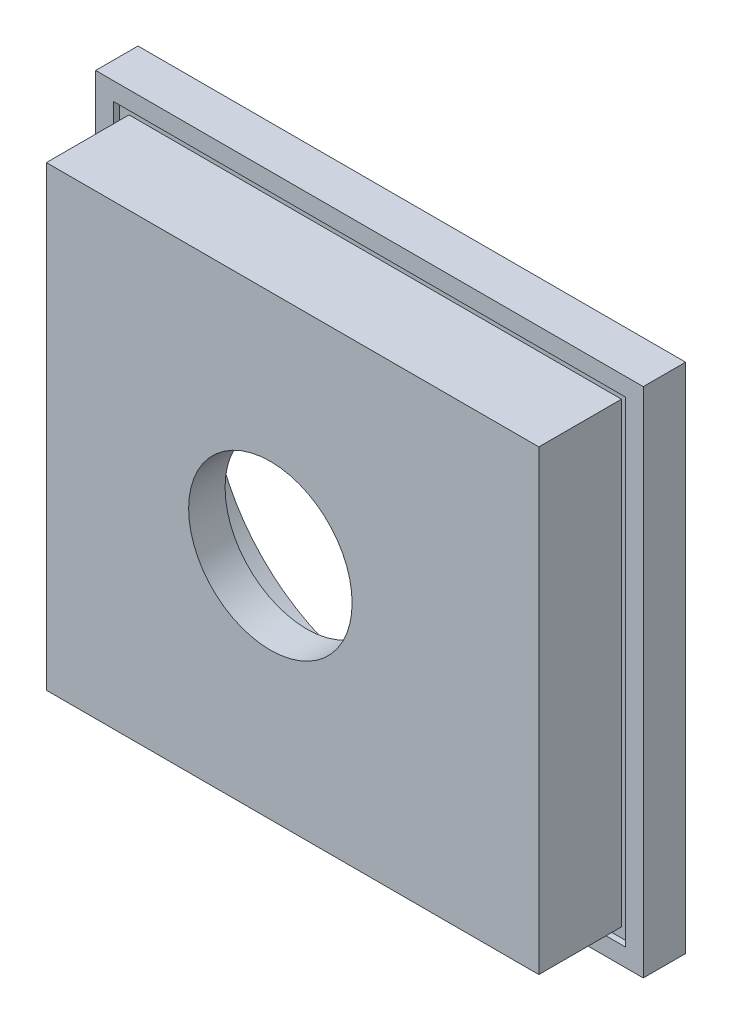
ISO-10303-21;
HEADER;
FILE_DESCRIPTION(('STEP AP214'),'2;1');
FILE_NAME('part.step','',(''),(''),'','','');
FILE_SCHEMA(('AUTOMOTIVE_DESIGN { 1 0 10303 214 1 1 1 1 }'));
ENDSEC;
DATA;
#1=APPLICATION_CONTEXT('core data for automotive mechanical design processes');
#2=APPLICATION_PROTOCOL_DEFINITION('international standard','automotive_design',2000,#1);
#3=PRODUCT_CONTEXT('',#1,'mechanical');
#4=PRODUCT('Part','Part','',(#3));
#5=PRODUCT_RELATED_PRODUCT_CATEGORY('part','',(#4));
#6=PRODUCT_DEFINITION_FORMATION('','',#4);
#7=PRODUCT_DEFINITION_CONTEXT('part definition',#1,'design');
#8=PRODUCT_DEFINITION('design','',#6,#7);
#9=PRODUCT_DEFINITION_SHAPE('','',#8);
#10=(LENGTH_UNIT() NAMED_UNIT(*) SI_UNIT(.MILLI.,.METRE.));
#11=(NAMED_UNIT(*) PLANE_ANGLE_UNIT() SI_UNIT($,.RADIAN.));
#12=(NAMED_UNIT(*) SI_UNIT($,.STERADIAN.) SOLID_ANGLE_UNIT());
#13=UNCERTAINTY_MEASURE_WITH_UNIT(LENGTH_MEASURE(1.E-05),#10,'distance_accuracy_value','');
#14=(GEOMETRIC_REPRESENTATION_CONTEXT(3) GLOBAL_UNCERTAINTY_ASSIGNED_CONTEXT((#13)) GLOBAL_UNIT_ASSIGNED_CONTEXT((#10,
#11,#12)) REPRESENTATION_CONTEXT('',''));
#15=CARTESIAN_POINT('',(0.,0.,0.));
#16=DIRECTION('',(0.,0.,1.));
#17=DIRECTION('',(1.,0.,0.));
#18=AXIS2_PLACEMENT_3D('',#15,#16,#17);
#19=CARTESIAN_POINT('',(127.7,130.,42.));
#20=DIRECTION('',(0.,0.,-1.));
#21=DIRECTION('',(-1.,0.,0.));
#22=AXIS2_PLACEMENT_3D('',#19,#20,#21);
#23=CYLINDRICAL_SURFACE('',#22,90.5);
#24=CARTESIAN_POINT('',(127.7,130.,0.));
#25=DIRECTION('',(0.,0.,1.));
#26=DIRECTION('',(1.,0.,0.));
#27=AXIS2_PLACEMENT_3D('',#24,#25,#26);
#28=CIRCLE('',#27,90.5);
#29=CARTESIAN_POINT('',(218.2,130.,0.));
#30=VERTEX_POINT('',#29);
#31=EDGE_CURVE('E272',#30,#30,#28,.T.);
#32=ORIENTED_EDGE('',*,*,#31,.F.);
#33=EDGE_LOOP('',(#32));
#34=FACE_BOUND('',#33,.T.);
#35=CARTESIAN_POINT('',(127.7,130.,42.));
#36=DIRECTION('',(0.,0.,1.));
#37=DIRECTION('',(1.,0.,0.));
#38=AXIS2_PLACEMENT_3D('',#35,#36,#37);
#39=CIRCLE('',#38,90.5);
#40=CARTESIAN_POINT('',(218.2,130.,42.));
#41=VERTEX_POINT('',#40);
#42=EDGE_CURVE('E268',#41,#41,#39,.T.);
#43=ORIENTED_EDGE('',*,*,#42,.T.);
#44=EDGE_LOOP('',(#43));
#45=FACE_BOUND('',#44,.T.);
#46=CARTESIAN_POINT('',(127.7,39.5,6.00000000000001));
#47=CARTESIAN_POINT('',(127.868461668725,39.5000006693389,6.00000745533471));
#48=CARTESIAN_POINT('',(128.03704430966,39.500475420697,6.01423729962665));
#49=CARTESIAN_POINT('',(128.369563332918,39.5023236582684,6.07080359932299));
#50=CARTESIAN_POINT('',(128.533493931284,39.503698216181,6.11317357142256));
#51=CARTESIAN_POINT('',(128.85184360416,39.5071904127946,6.22480957151065));
#52=CARTESIAN_POINT('',(129.006267312642,39.5093076860463,6.29406237371838));
#53=CARTESIAN_POINT('',(129.301254428058,39.5140465352439,6.45747905954885));
#54=CARTESIAN_POINT('',(129.44182119319,39.5166679885465,6.55163688702526));
#55=CARTESIAN_POINT('',(129.705221105626,39.5221215987173,6.76224808929431));
#56=CARTESIAN_POINT('',(129.828046288442,39.5249538493569,6.87871142316518));
#57=CARTESIAN_POINT('',(130.05240927785,39.5305090185251,7.13060969742526));
#58=CARTESIAN_POINT('',(130.153946233978,39.5332319326823,7.26604539539932));
#59=CARTESIAN_POINT('',(130.332865243994,39.5382618860058,7.55207638745825));
#60=CARTESIAN_POINT('',(130.410242173459,39.5405688369013,7.70267488867855));
#61=CARTESIAN_POINT('',(130.538611467042,39.544505788466,8.01473376018372));
#62=CARTESIAN_POINT('',(130.589603948693,39.5461357921509,8.17619408207942));
#63=CARTESIAN_POINT('',(130.663738797212,39.548534328688,8.50533001640761));
#64=CARTESIAN_POINT('',(130.686891473895,39.5493031804403,8.67300330428781));
#65=CARTESIAN_POINT('',(130.704721263274,39.5498936791272,9.00985822785477));
#66=CARTESIAN_POINT('',(130.699398503432,39.5497153303018,9.17903985678646));
#67=CARTESIAN_POINT('',(130.66043719998,39.5484318367469,9.51403906557217));
#68=CARTESIAN_POINT('',(130.626809797713,39.5473270566822,9.67985794278446));
#69=CARTESIAN_POINT('',(130.53221100757,39.5443158135154,10.0034956636558));
#70=CARTESIAN_POINT('',(130.471239552596,39.542409348446,10.1613144876831));
#71=CARTESIAN_POINT('',(130.32367063419,39.5380092236007,10.4645080649017));
#72=CARTESIAN_POINT('',(130.237068067339,39.5355154469051,10.6098803324154));
#73=CARTESIAN_POINT('',(130.040699033776,39.5302219378146,10.8840269513121));
#74=CARTESIAN_POINT('',(129.930932500387,39.5274222045389,11.0128012549155));
#75=CARTESIAN_POINT('',(129.691288400419,39.5218307656828,11.2501614086873));
#76=CARTESIAN_POINT('',(129.561401175114,39.519039064617,11.3587375075367));
#77=CARTESIAN_POINT('',(129.285236774167,39.5137796928698,11.5525440814761));
#78=CARTESIAN_POINT('',(129.138959595728,39.5113120222435,11.6377745525837));
#79=CARTESIAN_POINT('',(128.834162118433,39.5069788338669,11.7824694127845));
#80=CARTESIAN_POINT('',(128.675641671906,39.5051133233809,11.841933491041));
#81=CARTESIAN_POINT('',(128.350859939355,39.5021948558943,11.9334013484784));
#82=CARTESIAN_POINT('',(128.184598678986,39.501141896201,11.9654052186599));
#83=CARTESIAN_POINT('',(127.849139605765,39.4999675663169,12.001032226987));
#84=CARTESIAN_POINT('',(127.6799432273,39.4998457532538,12.0046688571849));
#85=CARTESIAN_POINT('',(127.343342384133,39.5005462740504,11.9834933207665));
#86=CARTESIAN_POINT('',(127.175937916878,39.5013686065642,11.9586811946998));
#87=CARTESIAN_POINT('',(126.847710550792,39.5038644623065,11.8813236392684));
#88=CARTESIAN_POINT('',(126.686886205605,39.5055377973808,11.8287843402005));
#89=CARTESIAN_POINT('',(126.376339885381,39.5095471193318,11.6974700602185));
#90=CARTESIAN_POINT('',(126.226617937851,39.5118831078503,11.618695014303));
#91=CARTESIAN_POINT('',(125.942464397464,39.5169557336091,11.4371106631431));
#92=CARTESIAN_POINT('',(125.808038607134,39.5196925219966,11.3342922820566));
#93=CARTESIAN_POINT('',(125.558351526558,39.5252578345468,11.1075532180054));
#94=CARTESIAN_POINT('',(125.443090294434,39.5280863589877,10.9836324710442));
#95=CARTESIAN_POINT('',(125.234959079449,39.5335175435777,10.7181484906926));
#96=CARTESIAN_POINT('',(125.142097805167,39.5361201156309,10.5765784280009));
#97=CARTESIAN_POINT('',(124.981462031146,39.540804575463,10.2798492708986));
#98=CARTESIAN_POINT('',(124.913687468302,39.5428864645515,10.124690210672));
#99=CARTESIAN_POINT('',(124.805164241662,39.5462941959245,9.80522017789086));
#100=CARTESIAN_POINT('',(124.7644099534,39.5476201955446,9.64091111769872));
#101=CARTESIAN_POINT('',(124.71106570951,39.5493670837606,9.30777817771377));
#102=CARTESIAN_POINT('',(124.698475712356,39.5497879736909,9.13895430457782));
#103=CARTESIAN_POINT('',(124.701818072997,39.5496771311941,8.80167108482766));
#104=CARTESIAN_POINT('',(124.717736704094,39.549145857227,8.63321160186203));
#105=CARTESIAN_POINT('',(124.777616193726,39.5471915412763,8.3013576877107));
#106=CARTESIAN_POINT('',(124.821577107632,39.5457684975319,8.13796326652712));
#107=CARTESIAN_POINT('',(124.936291156051,39.5421911362467,7.82087297961637));
#108=CARTESIAN_POINT('',(125.007044717949,39.5400368070407,7.66717726864472));
#109=CARTESIAN_POINT('',(125.173331556138,39.535239818264,7.37384855776981));
#110=CARTESIAN_POINT('',(125.268863953257,39.5325971760198,7.23421505917268));
#111=CARTESIAN_POINT('',(125.482039524629,39.5271201296457,6.97290983964526));
#112=CARTESIAN_POINT('',(125.599690970975,39.5242856540284,6.85124486908821));
#113=CARTESIAN_POINT('',(125.853783702316,39.5187444944926,6.62935939197558));
#114=CARTESIAN_POINT('',(125.990229628907,39.5160378423645,6.52914419844709));
#115=CARTESIAN_POINT('',(126.27809811239,39.5110563710085,6.35298232765119));
#116=CARTESIAN_POINT('',(126.429530884054,39.5087818494393,6.2770523540245));
#117=CARTESIAN_POINT('',(126.742886100432,39.5049261996033,6.15178313369161));
#118=CARTESIAN_POINT('',(126.904795792153,39.5033442458792,6.1024122156465));
#119=CARTESIAN_POINT('',(127.173105153563,39.5014742421491,6.04472973197653));
#120=CARTESIAN_POINT('',(127.277763714787,39.5009238039202,6.02797722653054));
#121=CARTESIAN_POINT('',(127.488265585228,39.5001864725459,6.0056100194304));
#122=CARTESIAN_POINT('',(127.594108894018,39.4999995792691,5.99999531374916));
#123=CARTESIAN_POINT('',(127.7,39.5,6.00000000000001));
#124=B_SPLINE_CURVE_WITH_KNOTS('',3,(#46,#47,#48,#49,#50,#51,#52,#53,#54,#55,#56,#57,#58,#59,
#60,#61,#62,#63,#64,#65,#66,#67,#68,#69,#70,#71,#72,#73,#74,#75,#76,#77,#78,#79,#80,#81,#82,#83,
#84,#85,#86,#87,#88,#89,#90,#91,#92,#93,#94,#95,#96,#97,#98,#99,#100,#101,#102,#103,#104,#105,
#106,#107,#108,#109,#110,#111,#112,#113,#114,#115,#116,#117,#118,#119,#120,#121,#122,#123),
.UNSPECIFIED.,.T.,.F.,(4,2,2,2,2,2,2,2,2,2,2,2,2,2,2,2,2,2,2,2,2,2,2,2,2,2,2,2,2,2,2,2,2,2,2,2,
2,2,4),(0.,0.504998486708911,1.01059954024219,1.51595216342126,2.02118201297409,
2.52663796827291,3.03211411267343,3.53769739753527,4.04327843018438,4.54867217511341,
5.05406365778116,5.55925629996511,6.0644501818013,6.56974472072814,7.07504071418544,
7.58058002565672,8.08611942336594,8.59166491955444,9.09720874040457,9.60251209937507,
10.1078147381083,10.6130057045029,11.1181979225612,11.6235811485378,12.1289659072038,
12.6345468321222,13.140126485252,13.6456008652554,14.1510745000037,14.656304818299,
15.1615361342244,15.6667755097343,16.1719969614228,16.6774077333081,17.1829435489884,
17.6888263336988,18.19410451473,18.5115349902596,18.8289653510165),.UNSPECIFIED.);
#125=CARTESIAN_POINT('',(127.7,39.5,6.00000000000001));
#126=VERTEX_POINT('',#125);
#127=EDGE_CURVE('E39',#126,#126,#124,.T.);
#128=ORIENTED_EDGE('',*,*,#127,.T.);
#129=EDGE_LOOP('',(#128));
#130=FACE_BOUND('',#129,.T.);
#131=ADVANCED_FACE('F35',(#34,#45,#130),#23,.F.);
#132=CARTESIAN_POINT('',(0.,0.,60.5));
#133=DIRECTION('',(1.,0.,0.));
#134=DIRECTION('',(0.,1.,0.));
#135=AXIS2_PLACEMENT_3D('',#132,#133,#134);
#136=PLANE('',#135);
#137=DIRECTION('',(0.,-1.,0.));
#138=VECTOR('',#137,1.);
#139=CARTESIAN_POINT('',(-1.11022302462516E-13,260.,21.5));
#140=LINE('',#139,#138);
#141=CARTESIAN_POINT('',(-1.11022302462516E-13,260.,21.5));
#142=VERTEX_POINT('',#141);
#143=CARTESIAN_POINT('',(-1.11022302462516E-13,0.,21.5));
#144=VERTEX_POINT('',#143);
#145=EDGE_CURVE('E239',#142,#144,#140,.T.);
#146=ORIENTED_EDGE('',*,*,#145,.F.);
#147=DIRECTION('',(0.,0.,-1.));
#148=VECTOR('',#147,1.);
#149=CARTESIAN_POINT('',(-1.11022302462516E-13,260.,60.5));
#150=LINE('',#149,#148);
#151=CARTESIAN_POINT('',(-1.11022302462516E-13,260.,0.));
#152=VERTEX_POINT('',#151);
#153=EDGE_CURVE('E286',#142,#152,#150,.T.);
#154=ORIENTED_EDGE('',*,*,#153,.T.);
#155=DIRECTION('',(0.,-1.,0.));
#156=VECTOR('',#155,1.);
#157=CARTESIAN_POINT('',(0.,0.,0.));
#158=LINE('',#157,#156);
#159=CARTESIAN_POINT('',(0.,0.,0.));
#160=VERTEX_POINT('',#159);
#161=EDGE_CURVE('E271',#152,#160,#158,.T.);
#162=ORIENTED_EDGE('',*,*,#161,.T.);
#163=DIRECTION('',(0.,0.,-1.));
#164=VECTOR('',#163,1.);
#165=CARTESIAN_POINT('',(0.,0.,60.5));
#166=LINE('',#165,#164);
#167=EDGE_CURVE('E292',#144,#160,#166,.T.);
#168=ORIENTED_EDGE('',*,*,#167,.F.);
#169=EDGE_LOOP('',(#146,#154,#162,#168));
#170=FACE_BOUND('',#169,.T.);
#171=ADVANCED_FACE('F37',(#170),#136,.F.);
#172=CARTESIAN_POINT('',(0.,0.,60.5));
#173=DIRECTION('',(0.,1.,0.));
#174=DIRECTION('',(0.,0.,1.));
#175=AXIS2_PLACEMENT_3D('',#172,#173,#174);
#176=PLANE('',#175);
#177=CARTESIAN_POINT('',(127.7,0.,9.));
#178=DIRECTION('',(0.,1.,0.));
#179=DIRECTION('',(0.,0.,1.));
#180=AXIS2_PLACEMENT_3D('',#177,#178,#179);
#181=CIRCLE('',#180,2.99999999999999);
#182=CARTESIAN_POINT('',(127.7,0.,12.));
#183=VERTEX_POINT('',#182);
#184=EDGE_CURVE('E371',#183,#183,#181,.T.);
#185=ORIENTED_EDGE('',*,*,#184,.T.);
#186=EDGE_LOOP('',(#185));
#187=FACE_BOUND('',#186,.T.);
#188=DIRECTION('',(1.,0.,0.));
#189=VECTOR('',#188,1.);
#190=CARTESIAN_POINT('',(-1.11022302462516E-13,0.,21.5));
#191=LINE('',#190,#189);
#192=CARTESIAN_POINT('',(278.,0.,21.5));
#193=VERTEX_POINT('',#192);
#194=EDGE_CURVE('E247',#144,#193,#191,.T.);
#195=ORIENTED_EDGE('',*,*,#194,.F.);
#196=ORIENTED_EDGE('',*,*,#167,.T.);
#197=DIRECTION('',(1.,0.,0.));
#198=VECTOR('',#197,1.);
#199=CARTESIAN_POINT('',(0.,0.,0.));
#200=LINE('',#199,#198);
#201=CARTESIAN_POINT('',(278.,0.,0.));
#202=VERTEX_POINT('',#201);
#203=EDGE_CURVE('E277',#160,#202,#200,.T.);
#204=ORIENTED_EDGE('',*,*,#203,.T.);
#205=DIRECTION('',(0.,0.,-1.));
#206=VECTOR('',#205,1.);
#207=CARTESIAN_POINT('',(278.,0.,60.5));
#208=LINE('',#207,#206);
#209=EDGE_CURVE('E290',#193,#202,#208,.T.);
#210=ORIENTED_EDGE('',*,*,#209,.F.);
#211=EDGE_LOOP('',(#195,#196,#204,#210));
#212=FACE_BOUND('',#211,.T.);
#213=ADVANCED_FACE('F339',(#187,#212),#176,.F.);
#214=CARTESIAN_POINT('',(278.,0.,60.5));
#215=DIRECTION('',(-1.,0.,0.));
#216=DIRECTION('',(0.,-1.,0.));
#217=AXIS2_PLACEMENT_3D('',#214,#215,#216);
#218=PLANE('',#217);
#219=DIRECTION('',(0.,1.,0.));
#220=VECTOR('',#219,1.);
#221=CARTESIAN_POINT('',(278.,260.,21.5));
#222=LINE('',#221,#220);
#223=CARTESIAN_POINT('',(278.,260.,21.5));
#224=VERTEX_POINT('',#223);
#225=EDGE_CURVE('E62',#193,#224,#222,.T.);
#226=ORIENTED_EDGE('',*,*,#225,.F.);
#227=ORIENTED_EDGE('',*,*,#209,.T.);
#228=DIRECTION('',(0.,1.,0.));
#229=VECTOR('',#228,1.);
#230=CARTESIAN_POINT('',(278.,0.,0.));
#231=LINE('',#230,#229);
#232=CARTESIAN_POINT('',(278.,260.,0.));
#233=VERTEX_POINT('',#232);
#234=EDGE_CURVE('E280',#202,#233,#231,.T.);
#235=ORIENTED_EDGE('',*,*,#234,.T.);
#236=DIRECTION('',(0.,0.,-1.));
#237=VECTOR('',#236,1.);
#238=CARTESIAN_POINT('',(278.,260.,60.5));
#239=LINE('',#238,#237);
#240=EDGE_CURVE('E288',#224,#233,#239,.T.);
#241=ORIENTED_EDGE('',*,*,#240,.F.);
#242=EDGE_LOOP('',(#226,#227,#235,#241));
#243=FACE_BOUND('',#242,.T.);
#244=ADVANCED_FACE('F360',(#243),#218,.F.);
#245=CARTESIAN_POINT('',(-1.11022302462516E-13,260.,60.5));
#246=DIRECTION('',(0.,-1.,0.));
#247=DIRECTION('',(0.,0.,-1.));
#248=AXIS2_PLACEMENT_3D('',#245,#246,#247);
#249=PLANE('',#248);
#250=DIRECTION('',(-1.,0.,0.));
#251=VECTOR('',#250,1.);
#252=CARTESIAN_POINT('',(-1.11022302462516E-13,260.,21.5));
#253=LINE('',#252,#251);
#254=EDGE_CURVE('E250',#224,#142,#253,.T.);
#255=ORIENTED_EDGE('',*,*,#254,.F.);
#256=ORIENTED_EDGE('',*,*,#240,.T.);
#257=DIRECTION('',(-1.,0.,0.));
#258=VECTOR('',#257,1.);
#259=CARTESIAN_POINT('',(-1.11022302462516E-13,260.,0.));
#260=LINE('',#259,#258);
#261=EDGE_CURVE('E283',#233,#152,#260,.T.);
#262=ORIENTED_EDGE('',*,*,#261,.T.);
#263=ORIENTED_EDGE('',*,*,#153,.F.);
#264=EDGE_LOOP('',(#255,#256,#262,#263));
#265=FACE_BOUND('',#264,.T.);
#266=ADVANCED_FACE('F352',(#265),#249,.F.);
#267=CARTESIAN_POINT('',(0.,0.,60.5));
#268=DIRECTION('',(0.,0.,-1.));
#269=DIRECTION('',(-1.,0.,0.));
#270=AXIS2_PLACEMENT_3D('',#267,#268,#269);
#271=PLANE('',#270);
#272=CARTESIAN_POINT('',(127.7,130.,60.5));
#273=DIRECTION('',(0.,0.,1.));
#274=DIRECTION('',(1.,0.,0.));
#275=AXIS2_PLACEMENT_3D('',#272,#273,#274);
#276=CIRCLE('',#275,41.5);
#277=CARTESIAN_POINT('',(169.2,130.,60.5));
#278=VERTEX_POINT('',#277);
#279=EDGE_CURVE('E262',#278,#278,#276,.T.);
#280=ORIENTED_EDGE('',*,*,#279,.F.);
#281=EDGE_LOOP('',(#280));
#282=FACE_BOUND('',#281,.T.);
#283=DIRECTION('',(0.,-1.,0.));
#284=VECTOR('',#283,1.);
#285=CARTESIAN_POINT('',(13.9999999999999,246.,60.5));
#286=LINE('',#285,#284);
#287=CARTESIAN_POINT('',(13.9999999999999,246.,60.5));
#288=VERTEX_POINT('',#287);
#289=CARTESIAN_POINT('',(13.9999999999999,14.,60.5));
#290=VERTEX_POINT('',#289);
#291=EDGE_CURVE('E217',#288,#290,#286,.T.);
#292=ORIENTED_EDGE('',*,*,#291,.T.);
#293=DIRECTION('',(1.,0.,0.));
#294=VECTOR('',#293,1.);
#295=CARTESIAN_POINT('',(13.9999999999999,14.,60.5));
#296=LINE('',#295,#294);
#297=CARTESIAN_POINT('',(264.,14.,60.5));
#298=VERTEX_POINT('',#297);
#299=EDGE_CURVE('E227',#290,#298,#296,.T.);
#300=ORIENTED_EDGE('',*,*,#299,.T.);
#301=DIRECTION('',(0.,1.,0.));
#302=VECTOR('',#301,1.);
#303=CARTESIAN_POINT('',(264.,246.,60.5));
#304=LINE('',#303,#302);
#305=CARTESIAN_POINT('',(264.,246.,60.5));
#306=VERTEX_POINT('',#305);
#307=EDGE_CURVE('E230',#298,#306,#304,.T.);
#308=ORIENTED_EDGE('',*,*,#307,.T.);
#309=DIRECTION('',(-1.,0.,0.));
#310=VECTOR('',#309,1.);
#311=CARTESIAN_POINT('',(13.9999999999999,246.,60.5));
#312=LINE('',#311,#310);
#313=EDGE_CURVE('E233',#306,#288,#312,.T.);
#314=ORIENTED_EDGE('',*,*,#313,.T.);
#315=EDGE_LOOP('',(#292,#300,#308,#314));
#316=FACE_BOUND('',#315,.T.);
#317=ADVANCED_FACE('F348',(#282,#316),#271,.F.);
#318=CARTESIAN_POINT('',(0.,0.,0.));
#319=DIRECTION('',(0.,0.,-1.));
#320=DIRECTION('',(-1.,0.,0.));
#321=AXIS2_PLACEMENT_3D('',#318,#319,#320);
#322=PLANE('',#321);
#323=ORIENTED_EDGE('',*,*,#31,.T.);
#324=EDGE_LOOP('',(#323));
#325=FACE_BOUND('',#324,.T.);
#326=CARTESIAN_POINT('',(127.7,130.,0.));
#327=DIRECTION('',(0.,0.,1.));
#328=DIRECTION('',(1.,0.,0.));
#329=AXIS2_PLACEMENT_3D('',#326,#327,#328);
#330=CIRCLE('',#329,95.05);
#331=CARTESIAN_POINT('',(222.75,130.,0.));
#332=VERTEX_POINT('',#331);
#333=EDGE_CURVE('E252',#332,#332,#330,.T.);
#334=ORIENTED_EDGE('',*,*,#333,.F.);
#335=EDGE_LOOP('',(#334));
#336=FACE_BOUND('',#335,.T.);
#337=ADVANCED_FACE('F351',(#325,#336),#322,.T.);
#338=CARTESIAN_POINT('',(181.45,223.097730906827,0.));
#339=DIRECTION('',(0.,0.,-1.));
#340=DIRECTION('',(-1.,0.,0.));
#341=AXIS2_PLACEMENT_3D('',#338,#339,#340);
#342=CIRCLE('',#341,3.99999999999998);
#343=CARTESIAN_POINT('',(177.45,223.097730906827,0.));
#344=VERTEX_POINT('',#343);
#345=EDGE_CURVE('E155',#344,#344,#342,.T.);
#346=ORIENTED_EDGE('',*,*,#345,.F.);
#347=EDGE_LOOP('',(#346));
#348=FACE_BOUND('',#347,.T.);
#349=CARTESIAN_POINT('',(77.9310465298928,225.285367557093,0.));
#350=DIRECTION('',(0.,0.,-1.));
#351=DIRECTION('',(-1.,0.,0.));
#352=AXIS2_PLACEMENT_3D('',#349,#350,#351);
#353=CIRCLE('',#352,3.99999999999999);
#354=CARTESIAN_POINT('',(73.9310465298928,225.285367557093,0.));
#355=VERTEX_POINT('',#354);
#356=EDGE_CURVE('E154',#355,#355,#353,.T.);
#357=ORIENTED_EDGE('',*,*,#356,.F.);
#358=EDGE_LOOP('',(#357));
#359=FACE_BOUND('',#358,.T.);
#360=CARTESIAN_POINT('',(20.1999999999999,130.,0.));
#361=DIRECTION('',(0.,0.,-1.));
#362=DIRECTION('',(-1.,0.,0.));
#363=AXIS2_PLACEMENT_3D('',#360,#361,#362);
#364=CIRCLE('',#363,3.99999999999999);
#365=CARTESIAN_POINT('',(16.1999999999999,130.,0.));
#366=VERTEX_POINT('',#365);
#367=EDGE_CURVE('E166',#366,#366,#364,.T.);
#368=ORIENTED_EDGE('',*,*,#367,.F.);
#369=EDGE_LOOP('',(#368));
#370=FACE_BOUND('',#369,.T.);
#371=CARTESIAN_POINT('',(73.9500000000005,36.9022690931725,0.));
#372=DIRECTION('',(0.,0.,-1.));
#373=DIRECTION('',(-1.,0.,0.));
#374=AXIS2_PLACEMENT_3D('',#371,#372,#373);
#375=CIRCLE('',#374,3.99999999999999);
#376=CARTESIAN_POINT('',(69.9500000000005,36.9022690931725,0.));
#377=VERTEX_POINT('',#376);
#378=EDGE_CURVE('E172',#377,#377,#375,.T.);
#379=ORIENTED_EDGE('',*,*,#378,.F.);
#380=EDGE_LOOP('',(#379));
#381=FACE_BOUND('',#380,.T.);
#382=CARTESIAN_POINT('',(181.449999999999,36.9022690931725,0.));
#383=DIRECTION('',(0.,0.,-1.));
#384=DIRECTION('',(-1.,0.,0.));
#385=AXIS2_PLACEMENT_3D('',#382,#383,#384);
#386=CIRCLE('',#385,4.);
#387=CARTESIAN_POINT('',(177.449999999999,36.9022690931725,0.));
#388=VERTEX_POINT('',#387);
#389=EDGE_CURVE('E178',#388,#388,#386,.T.);
#390=ORIENTED_EDGE('',*,*,#389,.F.);
#391=EDGE_LOOP('',(#390));
#392=FACE_BOUND('',#391,.T.);
#393=CARTESIAN_POINT('',(235.2,130.,0.));
#394=DIRECTION('',(0.,0.,-1.));
#395=DIRECTION('',(-1.,0.,0.));
#396=AXIS2_PLACEMENT_3D('',#393,#394,#395);
#397=CIRCLE('',#396,4.);
#398=CARTESIAN_POINT('',(231.2,130.,0.));
#399=VERTEX_POINT('',#398);
#400=EDGE_CURVE('E184',#399,#399,#397,.T.);
#401=ORIENTED_EDGE('',*,*,#400,.F.);
#402=EDGE_LOOP('',(#401));
#403=FACE_BOUND('',#402,.T.);
#404=CARTESIAN_POINT('',(127.7,130.,0.));
#405=DIRECTION('',(0.,0.,1.));
#406=DIRECTION('',(1.,0.,0.));
#407=AXIS2_PLACEMENT_3D('',#404,#405,#406);
#408=CIRCLE('',#407,99.95);
#409=CARTESIAN_POINT('',(227.65,130.,0.));
#410=VERTEX_POINT('',#409);
#411=EDGE_CURVE('E256',#410,#410,#408,.T.);
#412=ORIENTED_EDGE('',*,*,#411,.T.);
#413=EDGE_LOOP('',(#412));
#414=FACE_BOUND('',#413,.T.);
#415=ORIENTED_EDGE('',*,*,#161,.F.);
#416=ORIENTED_EDGE('',*,*,#261,.F.);
#417=ORIENTED_EDGE('',*,*,#234,.F.);
#418=ORIENTED_EDGE('',*,*,#203,.F.);
#419=EDGE_LOOP('',(#415,#416,#417,#418));
#420=FACE_BOUND('',#419,.T.);
#421=ADVANCED_FACE('F354',(#348,#359,#370,#381,#392,#403,#414,#420),#322,.T.);
#422=CARTESIAN_POINT('',(127.7,130.,42.));
#423=DIRECTION('',(0.,0.,1.));
#424=DIRECTION('',(1.,0.,0.));
#425=AXIS2_PLACEMENT_3D('',#422,#423,#424);
#426=PLANE('',#425);
#427=CARTESIAN_POINT('',(127.7,130.,42.));
#428=DIRECTION('',(0.,0.,1.));
#429=DIRECTION('',(1.,0.,0.));
#430=AXIS2_PLACEMENT_3D('',#427,#428,#429);
#431=CIRCLE('',#430,41.5);
#432=CARTESIAN_POINT('',(169.2,130.,42.));
#433=VERTEX_POINT('',#432);
#434=EDGE_CURVE('E267',#433,#433,#431,.F.);
#435=ORIENTED_EDGE('',*,*,#434,.F.);
#436=EDGE_LOOP('',(#435));
#437=FACE_BOUND('',#436,.T.);
#438=ORIENTED_EDGE('',*,*,#42,.F.);
#439=EDGE_LOOP('',(#438));
#440=FACE_BOUND('',#439,.T.);
#441=ADVANCED_FACE('F346',(#437,#440),#426,.F.);
#442=CARTESIAN_POINT('',(127.7,130.,60.5));
#443=DIRECTION('',(0.,0.,-1.));
#444=DIRECTION('',(-1.,0.,0.));
#445=AXIS2_PLACEMENT_3D('',#442,#443,#444);
#446=CYLINDRICAL_SURFACE('',#445,41.5);
#447=ORIENTED_EDGE('',*,*,#279,.T.);
#448=EDGE_LOOP('',(#447));
#449=FACE_BOUND('',#448,.T.);
#450=ORIENTED_EDGE('',*,*,#434,.T.);
#451=EDGE_LOOP('',(#450));
#452=FACE_BOUND('',#451,.T.);
#453=ADVANCED_FACE('F402',(#449,#452),#446,.F.);
#454=CARTESIAN_POINT('',(127.7,130.,2.95));
#455=DIRECTION('',(0.,0.,1.));
#456=DIRECTION('',(1.,0.,0.));
#457=AXIS2_PLACEMENT_3D('',#454,#455,#456);
#458=PLANE('',#457);
#459=CARTESIAN_POINT('',(127.7,130.,2.95));
#460=DIRECTION('',(0.,0.,1.));
#461=DIRECTION('',(1.,0.,0.));
#462=AXIS2_PLACEMENT_3D('',#459,#460,#461);
#463=CIRCLE('',#462,99.95);
#464=CARTESIAN_POINT('',(227.65,130.,2.95));
#465=VERTEX_POINT('',#464);
#466=EDGE_CURVE('E259',#465,#465,#463,.T.);
#467=ORIENTED_EDGE('',*,*,#466,.F.);
#468=EDGE_LOOP('',(#467));
#469=FACE_BOUND('',#468,.T.);
#470=CARTESIAN_POINT('',(127.7,130.,2.95));
#471=DIRECTION('',(0.,0.,1.));
#472=DIRECTION('',(1.,0.,0.));
#473=AXIS2_PLACEMENT_3D('',#470,#471,#472);
#474=CIRCLE('',#473,95.05);
#475=CARTESIAN_POINT('',(222.75,130.,2.95));
#476=VERTEX_POINT('',#475);
#477=EDGE_CURVE('E253',#476,#476,#474,.T.);
#478=ORIENTED_EDGE('',*,*,#477,.T.);
#479=EDGE_LOOP('',(#478));
#480=FACE_BOUND('',#479,.T.);
#481=ADVANCED_FACE('F399',(#469,#480),#458,.F.);
#482=CARTESIAN_POINT('',(127.7,130.,2.95));
#483=DIRECTION('',(0.,0.,-1.));
#484=DIRECTION('',(-1.,0.,0.));
#485=AXIS2_PLACEMENT_3D('',#482,#483,#484);
#486=CYLINDRICAL_SURFACE('',#485,99.95);
#487=ORIENTED_EDGE('',*,*,#466,.T.);
#488=EDGE_LOOP('',(#487));
#489=FACE_BOUND('',#488,.T.);
#490=ORIENTED_EDGE('',*,*,#411,.F.);
#491=EDGE_LOOP('',(#490));
#492=FACE_BOUND('',#491,.T.);
#493=ADVANCED_FACE('F394',(#489,#492),#486,.F.);
#494=CARTESIAN_POINT('',(127.7,130.,2.95));
#495=DIRECTION('',(0.,0.,-1.));
#496=DIRECTION('',(-1.,0.,0.));
#497=AXIS2_PLACEMENT_3D('',#494,#495,#496);
#498=CYLINDRICAL_SURFACE('',#497,95.05);
#499=ORIENTED_EDGE('',*,*,#477,.F.);
#500=EDGE_LOOP('',(#499));
#501=FACE_BOUND('',#500,.T.);
#502=ORIENTED_EDGE('',*,*,#333,.T.);
#503=EDGE_LOOP('',(#502));
#504=FACE_BOUND('',#503,.T.);
#505=ADVANCED_FACE('F385',(#501,#504),#498,.T.);
#506=CARTESIAN_POINT('',(0.,0.,21.5));
#507=DIRECTION('',(0.,0.,1.));
#508=DIRECTION('',(1.,0.,0.));
#509=AXIS2_PLACEMENT_3D('',#506,#507,#508);
#510=PLANE('',#509);
#511=DIRECTION('',(0.,-1.,0.));
#512=VECTOR('',#511,1.);
#513=CARTESIAN_POINT('',(9.09999999999993,0.,21.5));
#514=LINE('',#513,#512);
#515=CARTESIAN_POINT('',(9.0999999999999,250.9,21.5));
#516=VERTEX_POINT('',#515);
#517=CARTESIAN_POINT('',(9.09999999999993,9.10000000000001,21.5));
#518=VERTEX_POINT('',#517);
#519=EDGE_CURVE('E11',#516,#518,#514,.T.);
#520=ORIENTED_EDGE('',*,*,#519,.F.);
#521=DIRECTION('',(-1.,0.,0.));
#522=VECTOR('',#521,1.);
#523=CARTESIAN_POINT('',(0.,250.9,21.5));
#524=LINE('',#523,#522);
#525=CARTESIAN_POINT('',(268.9,250.9,21.5));
#526=VERTEX_POINT('',#525);
#527=EDGE_CURVE('E48',#526,#516,#524,.T.);
#528=ORIENTED_EDGE('',*,*,#527,.F.);
#529=DIRECTION('',(0.,1.,0.));
#530=VECTOR('',#529,1.);
#531=CARTESIAN_POINT('',(268.9,0.,21.5));
#532=LINE('',#531,#530);
#533=CARTESIAN_POINT('',(268.9,9.10000000000001,21.5));
#534=VERTEX_POINT('',#533);
#535=EDGE_CURVE('E298',#534,#526,#532,.T.);
#536=ORIENTED_EDGE('',*,*,#535,.F.);
#537=DIRECTION('',(1.,0.,0.));
#538=VECTOR('',#537,1.);
#539=CARTESIAN_POINT('',(0.,9.10000000000001,21.5));
#540=LINE('',#539,#538);
#541=EDGE_CURVE('E294',#518,#534,#540,.T.);
#542=ORIENTED_EDGE('',*,*,#541,.F.);
#543=EDGE_LOOP('',(#520,#528,#536,#542));
#544=FACE_BOUND('',#543,.T.);
#545=ORIENTED_EDGE('',*,*,#145,.T.);
#546=ORIENTED_EDGE('',*,*,#194,.T.);
#547=ORIENTED_EDGE('',*,*,#225,.T.);
#548=ORIENTED_EDGE('',*,*,#254,.T.);
#549=EDGE_LOOP('',(#545,#546,#547,#548));
#550=FACE_BOUND('',#549,.T.);
#551=ADVANCED_FACE('F311',(#544,#550),#510,.T.);
#552=CARTESIAN_POINT('',(13.9999999999999,246.,21.5));
#553=DIRECTION('',(-1.,0.,0.));
#554=DIRECTION('',(0.,0.,1.));
#555=AXIS2_PLACEMENT_3D('',#552,#553,#554);
#556=PLANE('',#555);
#557=ORIENTED_EDGE('',*,*,#291,.F.);
#558=DIRECTION('',(0.,0.,1.));
#559=VECTOR('',#558,1.);
#560=CARTESIAN_POINT('',(13.9999999999999,246.,21.5));
#561=LINE('',#560,#559);
#562=CARTESIAN_POINT('',(13.9999999999999,246.,18.55));
#563=VERTEX_POINT('',#562);
#564=EDGE_CURVE('E237',#563,#288,#561,.T.);
#565=ORIENTED_EDGE('',*,*,#564,.F.);
#566=DIRECTION('',(0.,-1.,0.));
#567=VECTOR('',#566,1.);
#568=CARTESIAN_POINT('',(13.9999999999999,14.,18.55));
#569=LINE('',#568,#567);
#570=CARTESIAN_POINT('',(13.9999999999999,14.,18.55));
#571=VERTEX_POINT('',#570);
#572=EDGE_CURVE('E190',#563,#571,#569,.T.);
#573=ORIENTED_EDGE('',*,*,#572,.T.);
#574=DIRECTION('',(0.,0.,1.));
#575=VECTOR('',#574,1.);
#576=CARTESIAN_POINT('',(13.9999999999999,14.,21.5));
#577=LINE('',#576,#575);
#578=EDGE_CURVE('E236',#571,#290,#577,.T.);
#579=ORIENTED_EDGE('',*,*,#578,.T.);
#580=EDGE_LOOP('',(#557,#565,#573,#579));
#581=FACE_BOUND('',#580,.T.);
#582=ADVANCED_FACE('F384',(#581),#556,.T.);
#583=CARTESIAN_POINT('',(13.9999999999999,246.,21.5));
#584=DIRECTION('',(0.,1.,0.));
#585=DIRECTION('',(0.,0.,1.));
#586=AXIS2_PLACEMENT_3D('',#583,#584,#585);
#587=PLANE('',#586);
#588=ORIENTED_EDGE('',*,*,#313,.F.);
#589=DIRECTION('',(0.,0.,1.));
#590=VECTOR('',#589,1.);
#591=CARTESIAN_POINT('',(264.,246.,21.5));
#592=LINE('',#591,#590);
#593=CARTESIAN_POINT('',(264.,246.,18.55));
#594=VERTEX_POINT('',#593);
#595=EDGE_CURVE('E240',#594,#306,#592,.T.);
#596=ORIENTED_EDGE('',*,*,#595,.F.);
#597=DIRECTION('',(-1.,0.,0.));
#598=VECTOR('',#597,1.);
#599=CARTESIAN_POINT('',(13.9999999999999,246.,18.55));
#600=LINE('',#599,#598);
#601=EDGE_CURVE('E199',#594,#563,#600,.T.);
#602=ORIENTED_EDGE('',*,*,#601,.T.);
#603=ORIENTED_EDGE('',*,*,#564,.T.);
#604=EDGE_LOOP('',(#588,#596,#602,#603));
#605=FACE_BOUND('',#604,.T.);
#606=ADVANCED_FACE('F391',(#605),#587,.T.);
#607=CARTESIAN_POINT('',(264.,246.,21.5));
#608=DIRECTION('',(1.,0.,0.));
#609=DIRECTION('',(0.,0.,-1.));
#610=AXIS2_PLACEMENT_3D('',#607,#608,#609);
#611=PLANE('',#610);
#612=ORIENTED_EDGE('',*,*,#307,.F.);
#613=DIRECTION('',(0.,0.,1.));
#614=VECTOR('',#613,1.);
#615=CARTESIAN_POINT('',(264.,14.,21.5));
#616=LINE('',#615,#614);
#617=CARTESIAN_POINT('',(264.,14.,18.55));
#618=VERTEX_POINT('',#617);
#619=EDGE_CURVE('E242',#618,#298,#616,.T.);
#620=ORIENTED_EDGE('',*,*,#619,.F.);
#621=DIRECTION('',(0.,1.,0.));
#622=VECTOR('',#621,1.);
#623=CARTESIAN_POINT('',(264.,14.,18.55));
#624=LINE('',#623,#622);
#625=EDGE_CURVE('E196',#618,#594,#624,.T.);
#626=ORIENTED_EDGE('',*,*,#625,.T.);
#627=ORIENTED_EDGE('',*,*,#595,.T.);
#628=EDGE_LOOP('',(#612,#620,#626,#627));
#629=FACE_BOUND('',#628,.T.);
#630=ADVANCED_FACE('F586',(#629),#611,.T.);
#631=CARTESIAN_POINT('',(13.9999999999999,14.,21.5));
#632=DIRECTION('',(0.,-1.,0.));
#633=DIRECTION('',(0.,0.,-1.));
#634=AXIS2_PLACEMENT_3D('',#631,#632,#633);
#635=PLANE('',#634);
#636=ORIENTED_EDGE('',*,*,#299,.F.);
#637=ORIENTED_EDGE('',*,*,#578,.F.);
#638=DIRECTION('',(1.,0.,0.));
#639=VECTOR('',#638,1.);
#640=CARTESIAN_POINT('',(13.9999999999999,14.,18.55));
#641=LINE('',#640,#639);
#642=EDGE_CURVE('E193',#571,#618,#641,.T.);
#643=ORIENTED_EDGE('',*,*,#642,.T.);
#644=ORIENTED_EDGE('',*,*,#619,.T.);
#645=EDGE_LOOP('',(#636,#637,#643,#644));
#646=FACE_BOUND('',#645,.T.);
#647=ADVANCED_FACE('F577',(#646),#635,.T.);
#648=CARTESIAN_POINT('',(9.0999999999999,250.9,18.55));
#649=DIRECTION('',(-1.,0.,0.));
#650=DIRECTION('',(0.,-1.,0.));
#651=AXIS2_PLACEMENT_3D('',#648,#649,#650);
#652=PLANE('',#651);
#653=ORIENTED_EDGE('',*,*,#519,.T.);
#654=DIRECTION('',(0.,0.,1.));
#655=VECTOR('',#654,1.);
#656=CARTESIAN_POINT('',(9.09999999999993,9.10000000000001,18.55));
#657=LINE('',#656,#655);
#658=CARTESIAN_POINT('',(9.09999999999993,9.10000000000001,18.55));
#659=VERTEX_POINT('',#658);
#660=EDGE_CURVE('E55',#659,#518,#657,.T.);
#661=ORIENTED_EDGE('',*,*,#660,.F.);
#662=DIRECTION('',(0.,-1.,0.));
#663=VECTOR('',#662,1.);
#664=CARTESIAN_POINT('',(9.0999999999999,250.9,18.55));
#665=LINE('',#664,#663);
#666=CARTESIAN_POINT('',(9.0999999999999,250.9,18.55));
#667=VERTEX_POINT('',#666);
#668=EDGE_CURVE('E202',#667,#659,#665,.T.);
#669=ORIENTED_EDGE('',*,*,#668,.F.);
#670=DIRECTION('',(0.,0.,1.));
#671=VECTOR('',#670,1.);
#672=CARTESIAN_POINT('',(9.0999999999999,250.9,18.55));
#673=LINE('',#672,#671);
#674=EDGE_CURVE('E214',#667,#516,#673,.T.);
#675=ORIENTED_EDGE('',*,*,#674,.T.);
#676=EDGE_LOOP('',(#653,#661,#669,#675));
#677=FACE_BOUND('',#676,.T.);
#678=ADVANCED_FACE('F309',(#677),#652,.F.);
#679=CARTESIAN_POINT('',(9.0999999999999,250.9,18.55));
#680=DIRECTION('',(0.,1.,0.));
#681=DIRECTION('',(0.,0.,1.));
#682=AXIS2_PLACEMENT_3D('',#679,#680,#681);
#683=PLANE('',#682);
#684=ORIENTED_EDGE('',*,*,#527,.T.);
#685=ORIENTED_EDGE('',*,*,#674,.F.);
#686=DIRECTION('',(-1.,0.,0.));
#687=VECTOR('',#686,1.);
#688=CARTESIAN_POINT('',(9.0999999999999,250.9,18.55));
#689=LINE('',#688,#687);
#690=CARTESIAN_POINT('',(268.9,250.9,18.55));
#691=VERTEX_POINT('',#690);
#692=EDGE_CURVE('E211',#691,#667,#689,.T.);
#693=ORIENTED_EDGE('',*,*,#692,.F.);
#694=DIRECTION('',(0.,0.,1.));
#695=VECTOR('',#694,1.);
#696=CARTESIAN_POINT('',(268.9,250.9,18.55));
#697=LINE('',#696,#695);
#698=EDGE_CURVE('E218',#691,#526,#697,.T.);
#699=ORIENTED_EDGE('',*,*,#698,.T.);
#700=EDGE_LOOP('',(#684,#685,#693,#699));
#701=FACE_BOUND('',#700,.T.);
#702=ADVANCED_FACE('F302',(#701),#683,.F.);
#703=CARTESIAN_POINT('',(268.9,250.9,18.55));
#704=DIRECTION('',(1.,0.,0.));
#705=DIRECTION('',(0.,1.,0.));
#706=AXIS2_PLACEMENT_3D('',#703,#704,#705);
#707=PLANE('',#706);
#708=ORIENTED_EDGE('',*,*,#535,.T.);
#709=ORIENTED_EDGE('',*,*,#698,.F.);
#710=DIRECTION('',(0.,1.,0.));
#711=VECTOR('',#710,1.);
#712=CARTESIAN_POINT('',(268.9,250.9,18.55));
#713=LINE('',#712,#711);
#714=CARTESIAN_POINT('',(268.9,9.10000000000001,18.55));
#715=VERTEX_POINT('',#714);
#716=EDGE_CURVE('E208',#715,#691,#713,.T.);
#717=ORIENTED_EDGE('',*,*,#716,.F.);
#718=DIRECTION('',(0.,0.,1.));
#719=VECTOR('',#718,1.);
#720=CARTESIAN_POINT('',(268.9,9.10000000000001,18.55));
#721=LINE('',#720,#719);
#722=EDGE_CURVE('E221',#715,#534,#721,.T.);
#723=ORIENTED_EDGE('',*,*,#722,.T.);
#724=EDGE_LOOP('',(#708,#709,#717,#723));
#725=FACE_BOUND('',#724,.T.);
#726=ADVANCED_FACE('F315',(#725),#707,.F.);
#727=CARTESIAN_POINT('',(9.09999999999993,9.10000000000001,18.55));
#728=DIRECTION('',(0.,-1.,0.));
#729=DIRECTION('',(0.,0.,-1.));
#730=AXIS2_PLACEMENT_3D('',#727,#728,#729);
#731=PLANE('',#730);
#732=ORIENTED_EDGE('',*,*,#541,.T.);
#733=ORIENTED_EDGE('',*,*,#722,.F.);
#734=DIRECTION('',(1.,0.,0.));
#735=VECTOR('',#734,1.);
#736=CARTESIAN_POINT('',(9.09999999999993,9.10000000000001,18.55));
#737=LINE('',#736,#735);
#738=EDGE_CURVE('E205',#659,#715,#737,.T.);
#739=ORIENTED_EDGE('',*,*,#738,.F.);
#740=ORIENTED_EDGE('',*,*,#660,.T.);
#741=EDGE_LOOP('',(#732,#733,#739,#740));
#742=FACE_BOUND('',#741,.T.);
#743=ADVANCED_FACE('F312',(#742),#731,.F.);
#744=CARTESIAN_POINT('',(0.,0.,18.55));
#745=DIRECTION('',(0.,0.,1.));
#746=DIRECTION('',(1.,0.,0.));
#747=AXIS2_PLACEMENT_3D('',#744,#745,#746);
#748=PLANE('',#747);
#749=ORIENTED_EDGE('',*,*,#601,.F.);
#750=ORIENTED_EDGE('',*,*,#625,.F.);
#751=ORIENTED_EDGE('',*,*,#642,.F.);
#752=ORIENTED_EDGE('',*,*,#572,.F.);
#753=EDGE_LOOP('',(#749,#750,#751,#752));
#754=FACE_BOUND('',#753,.T.);
#755=ORIENTED_EDGE('',*,*,#668,.T.);
#756=ORIENTED_EDGE('',*,*,#738,.T.);
#757=ORIENTED_EDGE('',*,*,#716,.T.);
#758=ORIENTED_EDGE('',*,*,#692,.T.);
#759=EDGE_LOOP('',(#755,#756,#757,#758));
#760=FACE_BOUND('',#759,.T.);
#761=ADVANCED_FACE('F317',(#754,#760),#748,.T.);
#762=CARTESIAN_POINT('',(235.2,130.,15.));
#763=DIRECTION('',(0.,0.,-1.));
#764=DIRECTION('',(-1.,0.,0.));
#765=AXIS2_PLACEMENT_3D('',#762,#763,#764);
#766=CONICAL_SURFACE('',#765,3.99999999999998,1.02974425867665);
#767=CARTESIAN_POINT('',(235.2,130.,17.4034424761102));
#768=VERTEX_POINT('',#767);
#769=VERTEX_LOOP('',#768);
#770=FACE_BOUND('',#769,.T.);
#771=CARTESIAN_POINT('',(235.2,130.,15.));
#772=DIRECTION('',(0.,0.,-1.));
#773=DIRECTION('',(-1.,0.,0.));
#774=AXIS2_PLACEMENT_3D('',#771,#772,#773);
#775=CIRCLE('',#774,3.99999999999998);
#776=CARTESIAN_POINT('',(231.2,130.,15.));
#777=VERTEX_POINT('',#776);
#778=EDGE_CURVE('E187',#777,#777,#775,.T.);
#779=ORIENTED_EDGE('',*,*,#778,.T.);
#780=EDGE_LOOP('',(#779));
#781=FACE_BOUND('',#780,.T.);
#782=ADVANCED_FACE('F319',(#770,#781),#766,.F.);
#783=CARTESIAN_POINT('',(235.2,130.,0.));
#784=DIRECTION('',(0.,0.,-1.));
#785=DIRECTION('',(-1.,0.,0.));
#786=AXIS2_PLACEMENT_3D('',#783,#784,#785);
#787=CYLINDRICAL_SURFACE('',#786,3.99999999999999);
#788=ORIENTED_EDGE('',*,*,#778,.F.);
#789=EDGE_LOOP('',(#788));
#790=FACE_BOUND('',#789,.T.);
#791=ORIENTED_EDGE('',*,*,#400,.T.);
#792=EDGE_LOOP('',(#791));
#793=FACE_BOUND('',#792,.T.);
#794=ADVANCED_FACE('F326',(#790,#793),#787,.F.);
#795=CARTESIAN_POINT('',(181.449999999999,36.9022690931725,15.));
#796=DIRECTION('',(0.,0.,-1.));
#797=DIRECTION('',(-1.,0.,0.));
#798=AXIS2_PLACEMENT_3D('',#795,#796,#797);
#799=CONICAL_SURFACE('',#798,3.99999999999998,1.02974425867665);
#800=CARTESIAN_POINT('',(181.449999999999,36.9022690931725,17.4034424761102));
#801=VERTEX_POINT('',#800);
#802=VERTEX_LOOP('',#801);
#803=FACE_BOUND('',#802,.T.);
#804=CARTESIAN_POINT('',(181.449999999999,36.9022690931725,15.));
#805=DIRECTION('',(0.,0.,-1.));
#806=DIRECTION('',(-1.,0.,0.));
#807=AXIS2_PLACEMENT_3D('',#804,#805,#806);
#808=CIRCLE('',#807,3.99999999999998);
#809=CARTESIAN_POINT('',(177.449999999999,36.9022690931725,15.));
#810=VERTEX_POINT('',#809);
#811=EDGE_CURVE('E181',#810,#810,#808,.T.);
#812=ORIENTED_EDGE('',*,*,#811,.T.);
#813=EDGE_LOOP('',(#812));
#814=FACE_BOUND('',#813,.T.);
#815=ADVANCED_FACE('F456',(#803,#814),#799,.F.);
#816=CARTESIAN_POINT('',(181.449999999999,36.9022690931725,0.));
#817=DIRECTION('',(0.,0.,-1.));
#818=DIRECTION('',(-1.,0.,0.));
#819=AXIS2_PLACEMENT_3D('',#816,#817,#818);
#820=CYLINDRICAL_SURFACE('',#819,3.99999999999999);
#821=ORIENTED_EDGE('',*,*,#811,.F.);
#822=EDGE_LOOP('',(#821));
#823=FACE_BOUND('',#822,.T.);
#824=ORIENTED_EDGE('',*,*,#389,.T.);
#825=EDGE_LOOP('',(#824));
#826=FACE_BOUND('',#825,.T.);
#827=ADVANCED_FACE('F452',(#823,#826),#820,.F.);
#828=CARTESIAN_POINT('',(73.9500000000005,36.9022690931725,15.));
#829=DIRECTION('',(0.,0.,-1.));
#830=DIRECTION('',(-1.,0.,0.));
#831=AXIS2_PLACEMENT_3D('',#828,#829,#830);
#832=CONICAL_SURFACE('',#831,3.99999999999999,1.02974425867665);
#833=CARTESIAN_POINT('',(73.9500000000005,36.9022690931725,17.4034424761102));
#834=VERTEX_POINT('',#833);
#835=VERTEX_LOOP('',#834);
#836=FACE_BOUND('',#835,.T.);
#837=CARTESIAN_POINT('',(73.9500000000005,36.9022690931725,15.));
#838=DIRECTION('',(0.,0.,-1.));
#839=DIRECTION('',(-1.,0.,0.));
#840=AXIS2_PLACEMENT_3D('',#837,#838,#839);
#841=CIRCLE('',#840,3.99999999999999);
#842=CARTESIAN_POINT('',(69.9500000000005,36.9022690931725,15.));
#843=VERTEX_POINT('',#842);
#844=EDGE_CURVE('E175',#843,#843,#841,.T.);
#845=ORIENTED_EDGE('',*,*,#844,.T.);
#846=EDGE_LOOP('',(#845));
#847=FACE_BOUND('',#846,.T.);
#848=ADVANCED_FACE('F448',(#836,#847),#832,.F.);
#849=CARTESIAN_POINT('',(73.9500000000005,36.9022690931725,0.));
#850=DIRECTION('',(0.,0.,-1.));
#851=DIRECTION('',(-1.,0.,0.));
#852=AXIS2_PLACEMENT_3D('',#849,#850,#851);
#853=CYLINDRICAL_SURFACE('',#852,3.99999999999999);
#854=ORIENTED_EDGE('',*,*,#844,.F.);
#855=EDGE_LOOP('',(#854));
#856=FACE_BOUND('',#855,.T.);
#857=ORIENTED_EDGE('',*,*,#378,.T.);
#858=EDGE_LOOP('',(#857));
#859=FACE_BOUND('',#858,.T.);
#860=ADVANCED_FACE('F444',(#856,#859),#853,.F.);
#861=CARTESIAN_POINT('',(20.1999999999999,130.,15.));
#862=DIRECTION('',(0.,0.,-1.));
#863=DIRECTION('',(-1.,0.,0.));
#864=AXIS2_PLACEMENT_3D('',#861,#862,#863);
#865=CONICAL_SURFACE('',#864,3.99999999999999,1.02974425867665);
#866=CARTESIAN_POINT('',(20.1999999999999,130.,17.4034424761102));
#867=VERTEX_POINT('',#866);
#868=VERTEX_LOOP('',#867);
#869=FACE_BOUND('',#868,.T.);
#870=CARTESIAN_POINT('',(20.1999999999999,130.,15.));
#871=DIRECTION('',(0.,0.,-1.));
#872=DIRECTION('',(-1.,0.,0.));
#873=AXIS2_PLACEMENT_3D('',#870,#871,#872);
#874=CIRCLE('',#873,3.99999999999999);
#875=CARTESIAN_POINT('',(16.1999999999999,130.,15.));
#876=VERTEX_POINT('',#875);
#877=EDGE_CURVE('E169',#876,#876,#874,.T.);
#878=ORIENTED_EDGE('',*,*,#877,.T.);
#879=EDGE_LOOP('',(#878));
#880=FACE_BOUND('',#879,.T.);
#881=ADVANCED_FACE('F440',(#869,#880),#865,.F.);
#882=CARTESIAN_POINT('',(20.1999999999999,130.,0.));
#883=DIRECTION('',(0.,0.,-1.));
#884=DIRECTION('',(-1.,0.,0.));
#885=AXIS2_PLACEMENT_3D('',#882,#883,#884);
#886=CYLINDRICAL_SURFACE('',#885,3.99999999999999);
#887=ORIENTED_EDGE('',*,*,#877,.F.);
#888=EDGE_LOOP('',(#887));
#889=FACE_BOUND('',#888,.T.);
#890=ORIENTED_EDGE('',*,*,#367,.T.);
#891=EDGE_LOOP('',(#890));
#892=FACE_BOUND('',#891,.T.);
#893=ADVANCED_FACE('F436',(#889,#892),#886,.F.);
#894=CARTESIAN_POINT('',(77.9310465298928,225.285367557093,15.));
#895=DIRECTION('',(0.,0.,-1.));
#896=DIRECTION('',(-1.,0.,0.));
#897=AXIS2_PLACEMENT_3D('',#894,#895,#896);
#898=CONICAL_SURFACE('',#897,3.99999999999999,1.02974425867665);
#899=CARTESIAN_POINT('',(77.9310465298928,225.285367557093,17.4034424761102));
#900=VERTEX_POINT('',#899);
#901=VERTEX_LOOP('',#900);
#902=FACE_BOUND('',#901,.T.);
#903=CARTESIAN_POINT('',(77.9310465298928,225.285367557093,15.));
#904=DIRECTION('',(0.,0.,-1.));
#905=DIRECTION('',(-1.,0.,0.));
#906=AXIS2_PLACEMENT_3D('',#903,#904,#905);
#907=CIRCLE('',#906,3.99999999999999);
#908=CARTESIAN_POINT('',(73.9310465298928,225.285367557093,15.));
#909=VERTEX_POINT('',#908);
#910=EDGE_CURVE('E158',#909,#909,#907,.T.);
#911=ORIENTED_EDGE('',*,*,#910,.T.);
#912=EDGE_LOOP('',(#911));
#913=FACE_BOUND('',#912,.T.);
#914=ADVANCED_FACE('F432',(#902,#913),#898,.F.);
#915=CARTESIAN_POINT('',(77.9310465298928,225.285367557093,0.));
#916=DIRECTION('',(0.,0.,-1.));
#917=DIRECTION('',(-1.,0.,0.));
#918=AXIS2_PLACEMENT_3D('',#915,#916,#917);
#919=CYLINDRICAL_SURFACE('',#918,3.99999999999999);
#920=ORIENTED_EDGE('',*,*,#910,.F.);
#921=EDGE_LOOP('',(#920));
#922=FACE_BOUND('',#921,.T.);
#923=ORIENTED_EDGE('',*,*,#356,.T.);
#924=EDGE_LOOP('',(#923));
#925=FACE_BOUND('',#924,.T.);
#926=ADVANCED_FACE('F148',(#922,#925),#919,.F.);
#927=CARTESIAN_POINT('',(181.45,223.097730906827,15.));
#928=DIRECTION('',(0.,0.,-1.));
#929=DIRECTION('',(-1.,0.,0.));
#930=AXIS2_PLACEMENT_3D('',#927,#928,#929);
#931=CONICAL_SURFACE('',#930,3.99999999999998,1.02974425867665);
#932=CARTESIAN_POINT('',(181.45,223.097730906827,17.4034424761102));
#933=VERTEX_POINT('',#932);
#934=VERTEX_LOOP('',#933);
#935=FACE_BOUND('',#934,.T.);
#936=CARTESIAN_POINT('',(181.45,223.097730906827,15.));
#937=DIRECTION('',(0.,0.,-1.));
#938=DIRECTION('',(-1.,0.,0.));
#939=AXIS2_PLACEMENT_3D('',#936,#937,#938);
#940=CIRCLE('',#939,3.99999999999998);
#941=CARTESIAN_POINT('',(177.45,223.097730906827,15.));
#942=VERTEX_POINT('',#941);
#943=EDGE_CURVE('E152',#942,#942,#940,.T.);
#944=ORIENTED_EDGE('',*,*,#943,.T.);
#945=EDGE_LOOP('',(#944));
#946=FACE_BOUND('',#945,.T.);
#947=ADVANCED_FACE('F144',(#935,#946),#931,.F.);
#948=CARTESIAN_POINT('',(181.45,223.097730906827,0.));
#949=DIRECTION('',(0.,0.,-1.));
#950=DIRECTION('',(-1.,0.,0.));
#951=AXIS2_PLACEMENT_3D('',#948,#949,#950);
#952=CYLINDRICAL_SURFACE('',#951,3.99999999999998);
#953=ORIENTED_EDGE('',*,*,#943,.F.);
#954=EDGE_LOOP('',(#953));
#955=FACE_BOUND('',#954,.T.);
#956=ORIENTED_EDGE('',*,*,#345,.T.);
#957=EDGE_LOOP('',(#956));
#958=FACE_BOUND('',#957,.T.);
#959=ADVANCED_FACE('F147',(#955,#958),#952,.F.);
#960=CARTESIAN_POINT('',(127.7,59.,9.));
#961=DIRECTION('',(0.,-1.,0.));
#962=DIRECTION('',(0.,0.,-1.));
#963=AXIS2_PLACEMENT_3D('',#960,#961,#962);
#964=CYLINDRICAL_SURFACE('',#963,2.99999999999999);
#965=ORIENTED_EDGE('',*,*,#127,.F.);
#966=EDGE_LOOP('',(#965));
#967=FACE_BOUND('',#966,.T.);
#968=ORIENTED_EDGE('',*,*,#184,.F.);
#969=EDGE_LOOP('',(#968));
#970=FACE_BOUND('',#969,.T.);
#971=ADVANCED_FACE('F421',(#967,#970),#964,.F.);
#972=CLOSED_SHELL('',(#131,#171,#213,#244,#266,#317,#337,#421,#441,#453,#481,#493,#505,#551,
#582,#606,#630,#647,#678,#702,#726,#743,#761,#782,#794,#815,#827,#848,#860,#881,#893,#914,#926,
#947,#959,#971));
#973=MANIFOLD_SOLID_BREP('B2',#972);
#974=ADVANCED_BREP_SHAPE_REPRESENTATION('',(#18,#973),#14);
#975=SHAPE_DEFINITION_REPRESENTATION(#9,#974);
ENDSEC;
END-ISO-10303-21;
